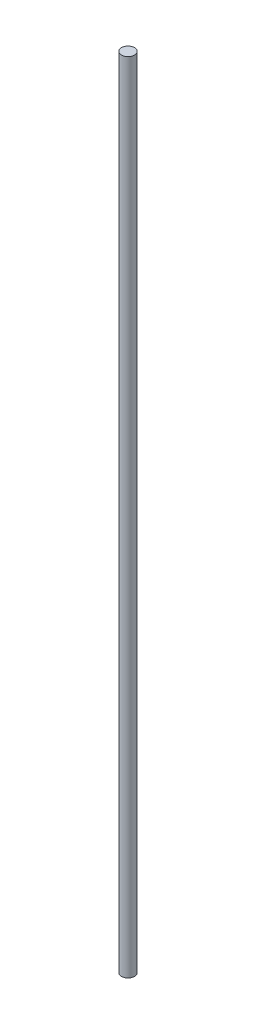
ISO-10303-21;
HEADER;
FILE_DESCRIPTION(('STEP AP214'),'2;1');
FILE_NAME('part.step','',(''),(''),'','','');
FILE_SCHEMA(('AUTOMOTIVE_DESIGN { 1 0 10303 214 1 1 1 1 }'));
ENDSEC;
DATA;
#1=APPLICATION_CONTEXT('core data for automotive mechanical design processes');
#2=APPLICATION_PROTOCOL_DEFINITION('international standard','automotive_design',2000,#1);
#3=PRODUCT_CONTEXT('',#1,'mechanical');
#4=PRODUCT('Part','Part','',(#3));
#5=PRODUCT_RELATED_PRODUCT_CATEGORY('part','',(#4));
#6=PRODUCT_DEFINITION_FORMATION('','',#4);
#7=PRODUCT_DEFINITION_CONTEXT('part definition',#1,'design');
#8=PRODUCT_DEFINITION('design','',#6,#7);
#9=PRODUCT_DEFINITION_SHAPE('','',#8);
#10=(LENGTH_UNIT() NAMED_UNIT(*) SI_UNIT(.MILLI.,.METRE.));
#11=(NAMED_UNIT(*) PLANE_ANGLE_UNIT() SI_UNIT($,.RADIAN.));
#12=(NAMED_UNIT(*) SI_UNIT($,.STERADIAN.) SOLID_ANGLE_UNIT());
#13=UNCERTAINTY_MEASURE_WITH_UNIT(LENGTH_MEASURE(1.E-05),#10,'distance_accuracy_value','');
#14=(GEOMETRIC_REPRESENTATION_CONTEXT(3) GLOBAL_UNCERTAINTY_ASSIGNED_CONTEXT((#13)) GLOBAL_UNIT_ASSIGNED_CONTEXT((#10,
#11,#12)) REPRESENTATION_CONTEXT('',''));
#15=CARTESIAN_POINT('',(0.,0.,0.));
#16=DIRECTION('',(0.,0.,1.));
#17=DIRECTION('',(1.,0.,0.));
#18=AXIS2_PLACEMENT_3D('',#15,#16,#17);
#19=CARTESIAN_POINT('',(0.,490.56,0.));
#20=DIRECTION('',(0.,-1.,0.));
#21=DIRECTION('',(0.,0.,-1.));
#22=AXIS2_PLACEMENT_3D('',#19,#20,#21);
#23=CYLINDRICAL_SURFACE('',#22,4.);
#24=CARTESIAN_POINT('',(0.,490.56,0.));
#25=DIRECTION('',(0.,1.,0.));
#26=DIRECTION('',(0.,0.,1.));
#27=AXIS2_PLACEMENT_3D('',#24,#25,#26);
#28=CIRCLE('',#27,4.);
#29=CARTESIAN_POINT('',(0.,490.56,4.));
#30=VERTEX_POINT('',#29);
#31=EDGE_CURVE('E10',#30,#30,#28,.T.);
#32=ORIENTED_EDGE('',*,*,#31,.F.);
#33=EDGE_LOOP('',(#32));
#34=FACE_BOUND('',#33,.T.);
#35=CARTESIAN_POINT('',(0.,0.,0.));
#36=DIRECTION('',(0.,1.,0.));
#37=DIRECTION('',(0.,0.,1.));
#38=AXIS2_PLACEMENT_3D('',#35,#36,#37);
#39=CIRCLE('',#38,4.);
#40=CARTESIAN_POINT('',(0.,0.,4.));
#41=VERTEX_POINT('',#40);
#42=EDGE_CURVE('E36',#41,#41,#39,.T.);
#43=ORIENTED_EDGE('',*,*,#42,.T.);
#44=EDGE_LOOP('',(#43));
#45=FACE_BOUND('',#44,.T.);
#46=ADVANCED_FACE('F33',(#34,#45),#23,.T.);
#47=CARTESIAN_POINT('',(0.,490.56,0.));
#48=DIRECTION('',(0.,1.,0.));
#49=DIRECTION('',(0.,0.,1.));
#50=AXIS2_PLACEMENT_3D('',#47,#48,#49);
#51=PLANE('',#50);
#52=ORIENTED_EDGE('',*,*,#31,.T.);
#53=EDGE_LOOP('',(#52));
#54=FACE_BOUND('',#53,.T.);
#55=ADVANCED_FACE('F48',(#54),#51,.T.);
#56=CARTESIAN_POINT('',(0.,0.,0.));
#57=DIRECTION('',(0.,1.,0.));
#58=DIRECTION('',(0.,0.,1.));
#59=AXIS2_PLACEMENT_3D('',#56,#57,#58);
#60=PLANE('',#59);
#61=ORIENTED_EDGE('',*,*,#42,.F.);
#62=EDGE_LOOP('',(#61));
#63=FACE_BOUND('',#62,.T.);
#64=ADVANCED_FACE('F46',(#63),#60,.F.);
#65=CLOSED_SHELL('',(#46,#55,#64));
#66=MANIFOLD_SOLID_BREP('B2',#65);
#67=ADVANCED_BREP_SHAPE_REPRESENTATION('',(#18,#66),#14);
#68=SHAPE_DEFINITION_REPRESENTATION(#9,#67);
ENDSEC;
END-ISO-10303-21;
